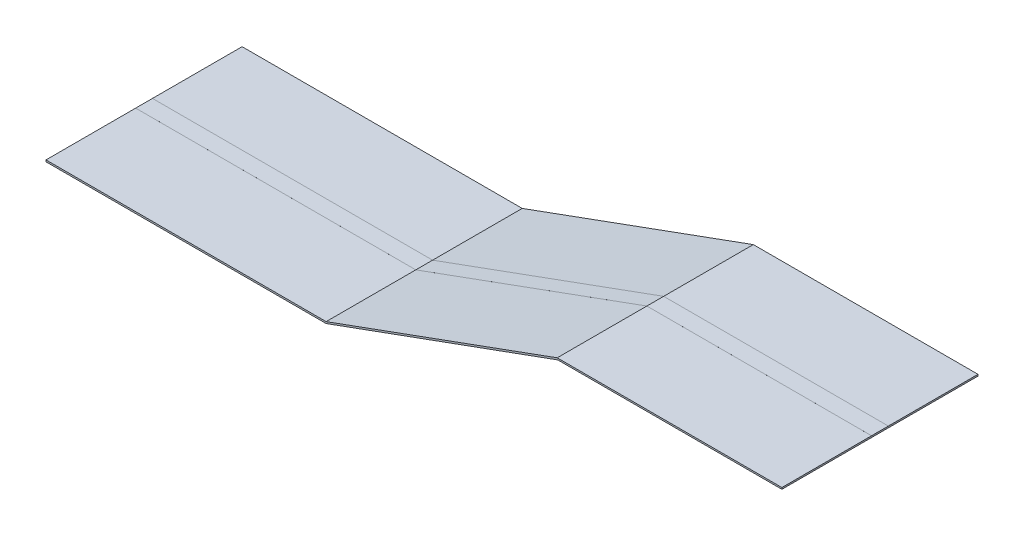
ISO-10303-21;
HEADER;
FILE_DESCRIPTION(('STEP AP214'),'2;1');
FILE_NAME('part.step','',(''),(''),'','','');
FILE_SCHEMA(('AUTOMOTIVE_DESIGN { 1 0 10303 214 1 1 1 1 }'));
ENDSEC;
DATA;
#1=APPLICATION_CONTEXT('core data for automotive mechanical design processes');
#2=APPLICATION_PROTOCOL_DEFINITION('international standard','automotive_design',2000,#1);
#3=PRODUCT_CONTEXT('',#1,'mechanical');
#4=PRODUCT('Part','Part','',(#3));
#5=PRODUCT_RELATED_PRODUCT_CATEGORY('part','',(#4));
#6=PRODUCT_DEFINITION_FORMATION('','',#4);
#7=PRODUCT_DEFINITION_CONTEXT('part definition',#1,'design');
#8=PRODUCT_DEFINITION('design','',#6,#7);
#9=PRODUCT_DEFINITION_SHAPE('','',#8);
#10=(LENGTH_UNIT() NAMED_UNIT(*) SI_UNIT(.MILLI.,.METRE.));
#11=(NAMED_UNIT(*) PLANE_ANGLE_UNIT() SI_UNIT($,.RADIAN.));
#12=(NAMED_UNIT(*) SI_UNIT($,.STERADIAN.) SOLID_ANGLE_UNIT());
#13=UNCERTAINTY_MEASURE_WITH_UNIT(LENGTH_MEASURE(1.E-05),#10,'distance_accuracy_value','');
#14=(GEOMETRIC_REPRESENTATION_CONTEXT(3) GLOBAL_UNCERTAINTY_ASSIGNED_CONTEXT((#13)) GLOBAL_UNIT_ASSIGNED_CONTEXT((#10,
#11,#12)) REPRESENTATION_CONTEXT('',''));
#15=CARTESIAN_POINT('',(0.,0.,0.));
#16=DIRECTION('',(0.,0.,1.));
#17=DIRECTION('',(1.,0.,0.));
#18=AXIS2_PLACEMENT_3D('',#15,#16,#17);
#19=CARTESIAN_POINT('',(412.43753092473,153.307517797124,350.));
#20=DIRECTION('',(0.,-1.,0.));
#21=DIRECTION('',(0.,0.,-1.));
#22=AXIS2_PLACEMENT_3D('',#19,#20,#21);
#23=PLANE('',#22);
#24=DIRECTION('',(1.,0.,0.));
#25=VECTOR('',#24,1.);
#26=CARTESIAN_POINT('',(813.46132907173,153.307517797124,190.));
#27=LINE('',#26,#25);
#28=CARTESIAN_POINT('',(412.43753092473,153.307517797124,190.));
#29=VERTEX_POINT('',#28);
#30=CARTESIAN_POINT('',(813.46132907173,153.307517797124,190.));
#31=VERTEX_POINT('',#30);
#32=EDGE_CURVE('E322',#29,#31,#27,.T.);
#33=ORIENTED_EDGE('',*,*,#32,.F.);
#34=DIRECTION('',(0.,0.,-1.));
#35=VECTOR('',#34,1.);
#36=CARTESIAN_POINT('',(412.43753092473,153.307517797124,350.));
#37=LINE('',#36,#35);
#38=CARTESIAN_POINT('',(412.43753092473,153.307517797124,350.));
#39=VERTEX_POINT('',#38);
#40=EDGE_CURVE('E264',#39,#29,#37,.T.);
#41=ORIENTED_EDGE('',*,*,#40,.F.);
#42=DIRECTION('',(-1.,0.,0.));
#43=VECTOR('',#42,1.);
#44=CARTESIAN_POINT('',(412.43753092473,153.307517797124,350.));
#45=LINE('',#44,#43);
#46=CARTESIAN_POINT('',(813.4647531458,153.307517797124,350.));
#47=VERTEX_POINT('',#46);
#48=EDGE_CURVE('E221',#47,#39,#45,.T.);
#49=ORIENTED_EDGE('',*,*,#48,.F.);
#50=DIRECTION('',(0.,0.,-1.));
#51=VECTOR('',#50,1.);
#52=CARTESIAN_POINT('',(813.4647531458,153.307517797124,350.));
#53=LINE('',#52,#51);
#54=CARTESIAN_POINT('',(813.4647531458,153.307517797124,0.));
#55=VERTEX_POINT('',#54);
#56=EDGE_CURVE('E267',#47,#55,#53,.T.);
#57=ORIENTED_EDGE('',*,*,#56,.T.);
#58=DIRECTION('',(-1.,0.,0.));
#59=VECTOR('',#58,1.);
#60=CARTESIAN_POINT('',(412.43753092473,153.307517797124,0.));
#61=LINE('',#60,#59);
#62=CARTESIAN_POINT('',(412.43753092473,153.307517797124,0.));
#63=VERTEX_POINT('',#62);
#64=EDGE_CURVE('E238',#55,#63,#61,.T.);
#65=ORIENTED_EDGE('',*,*,#64,.T.);
#66=CARTESIAN_POINT('',(412.43753092473,153.307517797124,160.));
#67=VERTEX_POINT('',#66);
#68=EDGE_CURVE('E263',#67,#63,#37,.T.);
#69=ORIENTED_EDGE('',*,*,#68,.F.);
#70=DIRECTION('',(-1.,0.,0.));
#71=VECTOR('',#70,1.);
#72=CARTESIAN_POINT('',(813.46132907173,153.307517797124,160.));
#73=LINE('',#72,#71);
#74=CARTESIAN_POINT('',(813.46132907173,153.307517797124,160.));
#75=VERTEX_POINT('',#74);
#76=EDGE_CURVE('E169',#75,#67,#73,.T.);
#77=ORIENTED_EDGE('',*,*,#76,.F.);
#78=DIRECTION('',(0.,0.,-1.));
#79=VECTOR('',#78,1.);
#80=CARTESIAN_POINT('',(813.46132907173,153.307517797124,190.));
#81=LINE('',#80,#79);
#82=EDGE_CURVE('E318',#31,#75,#81,.T.);
#83=ORIENTED_EDGE('',*,*,#82,.F.);
#84=EDGE_LOOP('',(#33,#41,#49,#57,#65,#69,#77,#83));
#85=FACE_BOUND('',#84,.T.);
#86=ADVANCED_FACE('F32',(#85),#23,.F.);
#87=CARTESIAN_POINT('',(0.,2.99999999999994,350.));
#88=DIRECTION('',(0.342407407023272,-0.939551577943223,0.));
#89=DIRECTION('',(0.939551577943223,0.342407407023272,0.));
#90=AXIS2_PLACEMENT_3D('',#87,#88,#89);
#91=PLANE('',#90);
#92=DIRECTION('',(0.939551577943223,0.342407407023272,0.));
#93=VECTOR('',#92,1.);
#94=CARTESIAN_POINT('',(412.43753092473,153.307517797124,190.));
#95=LINE('',#94,#93);
#96=CARTESIAN_POINT('',(0.,2.99999999999994,190.));
#97=VERTEX_POINT('',#96);
#98=EDGE_CURVE('E175',#97,#29,#95,.T.);
#99=ORIENTED_EDGE('',*,*,#98,.F.);
#100=DIRECTION('',(0.,0.,-1.));
#101=VECTOR('',#100,1.);
#102=CARTESIAN_POINT('',(0.,2.99999999999994,350.));
#103=LINE('',#102,#101);
#104=CARTESIAN_POINT('',(0.,2.99999999999994,350.));
#105=VERTEX_POINT('',#104);
#106=EDGE_CURVE('E260',#105,#97,#103,.T.);
#107=ORIENTED_EDGE('',*,*,#106,.F.);
#108=DIRECTION('',(-0.939551577943223,-0.342407407023272,0.));
#109=VECTOR('',#108,1.);
#110=CARTESIAN_POINT('',(0.,2.99999999999994,350.));
#111=LINE('',#110,#109);
#112=EDGE_CURVE('E223',#39,#105,#111,.T.);
#113=ORIENTED_EDGE('',*,*,#112,.F.);
#114=ORIENTED_EDGE('',*,*,#40,.T.);
#115=EDGE_LOOP('',(#99,#107,#113,#114));
#116=FACE_BOUND('',#115,.T.);
#117=ADVANCED_FACE('F343',(#116),#91,.F.);
#118=DIRECTION('',(-0.939551577943223,-0.342407407023272,0.));
#119=VECTOR('',#118,1.);
#120=CARTESIAN_POINT('',(412.43753092473,153.307517797124,160.));
#121=LINE('',#120,#119);
#122=CARTESIAN_POINT('',(0.,2.99999999999994,160.));
#123=VERTEX_POINT('',#122);
#124=EDGE_CURVE('E186',#67,#123,#121,.T.);
#125=ORIENTED_EDGE('',*,*,#124,.F.);
#126=ORIENTED_EDGE('',*,*,#68,.T.);
#127=DIRECTION('',(-0.939551577943223,-0.342407407023272,0.));
#128=VECTOR('',#127,1.);
#129=CARTESIAN_POINT('',(0.,2.99999999999994,0.));
#130=LINE('',#129,#128);
#131=CARTESIAN_POINT('',(0.,2.99999999999994,0.));
#132=VERTEX_POINT('',#131);
#133=EDGE_CURVE('E241',#63,#132,#130,.T.);
#134=ORIENTED_EDGE('',*,*,#133,.T.);
#135=EDGE_CURVE('E259',#123,#132,#103,.T.);
#136=ORIENTED_EDGE('',*,*,#135,.F.);
#137=EDGE_LOOP('',(#125,#126,#134,#136));
#138=FACE_BOUND('',#137,.T.);
#139=ADVANCED_FACE('F314',(#138),#91,.F.);
#140=CARTESIAN_POINT('',(-500.,2.99999999999994,350.));
#141=DIRECTION('',(0.,-1.,0.));
#142=DIRECTION('',(0.,0.,-1.));
#143=AXIS2_PLACEMENT_3D('',#140,#141,#142);
#144=PLANE('',#143);
#145=DIRECTION('',(-1.,0.,0.));
#146=VECTOR('',#145,1.);
#147=CARTESIAN_POINT('',(-500.,2.99999999999994,160.));
#148=LINE('',#147,#146);
#149=CARTESIAN_POINT('',(-500.,2.99999999999994,160.));
#150=VERTEX_POINT('',#149);
#151=EDGE_CURVE('E197',#123,#150,#148,.T.);
#152=ORIENTED_EDGE('',*,*,#151,.F.);
#153=ORIENTED_EDGE('',*,*,#135,.T.);
#154=DIRECTION('',(-1.,0.,0.));
#155=VECTOR('',#154,1.);
#156=CARTESIAN_POINT('',(-500.,2.99999999999994,0.));
#157=LINE('',#156,#155);
#158=CARTESIAN_POINT('',(-500.,2.99999999999994,0.));
#159=VERTEX_POINT('',#158);
#160=EDGE_CURVE('E244',#132,#159,#157,.T.);
#161=ORIENTED_EDGE('',*,*,#160,.T.);
#162=DIRECTION('',(0.,0.,-1.));
#163=VECTOR('',#162,1.);
#164=CARTESIAN_POINT('',(-500.,2.99999999999994,350.));
#165=LINE('',#164,#163);
#166=EDGE_CURVE('E255',#150,#159,#165,.T.);
#167=ORIENTED_EDGE('',*,*,#166,.F.);
#168=EDGE_LOOP('',(#152,#153,#161,#167));
#169=FACE_BOUND('',#168,.T.);
#170=ADVANCED_FACE('F310',(#169),#144,.F.);
#171=DIRECTION('',(1.,0.,0.));
#172=VECTOR('',#171,1.);
#173=CARTESIAN_POINT('',(-500.,2.99999999999994,190.));
#174=LINE('',#173,#172);
#175=CARTESIAN_POINT('',(-500.,2.99999999999994,190.));
#176=VERTEX_POINT('',#175);
#177=EDGE_CURVE('E201',#176,#97,#174,.T.);
#178=ORIENTED_EDGE('',*,*,#177,.F.);
#179=CARTESIAN_POINT('',(-500.,2.99999999999994,350.));
#180=VERTEX_POINT('',#179);
#181=EDGE_CURVE('E256',#180,#176,#165,.T.);
#182=ORIENTED_EDGE('',*,*,#181,.F.);
#183=DIRECTION('',(-1.,0.,0.));
#184=VECTOR('',#183,1.);
#185=CARTESIAN_POINT('',(-500.,2.99999999999994,350.));
#186=LINE('',#185,#184);
#187=EDGE_CURVE('E225',#105,#180,#186,.T.);
#188=ORIENTED_EDGE('',*,*,#187,.F.);
#189=ORIENTED_EDGE('',*,*,#106,.T.);
#190=EDGE_LOOP('',(#178,#182,#188,#189));
#191=FACE_BOUND('',#190,.T.);
#192=ADVANCED_FACE('F347',(#191),#144,.F.);
#193=CARTESIAN_POINT('',(413.4647531458,150.488863063295,350.));
#194=DIRECTION('',(-0.34202014332567,0.939692620785908,0.));
#195=DIRECTION('',(-0.939692620785908,-0.34202014332567,0.));
#196=AXIS2_PLACEMENT_3D('',#193,#194,#195);
#197=PLANE('',#196);
#198=DIRECTION('',(0.939692620785908,0.34202014332567,0.));
#199=VECTOR('',#198,1.);
#200=CARTESIAN_POINT('',(413.4647531458,150.488863063295,0.));
#201=LINE('',#200,#199);
#202=CARTESIAN_POINT('',(0.,0.,0.));
#203=VERTEX_POINT('',#202);
#204=CARTESIAN_POINT('',(413.4647531458,150.488863063295,0.));
#205=VERTEX_POINT('',#204);
#206=EDGE_CURVE('E212',#203,#205,#201,.T.);
#207=ORIENTED_EDGE('',*,*,#206,.T.);
#208=DIRECTION('',(0.,0.,-1.));
#209=VECTOR('',#208,1.);
#210=CARTESIAN_POINT('',(413.4647531458,150.488863063295,350.));
#211=LINE('',#210,#209);
#212=CARTESIAN_POINT('',(413.4647531458,150.488863063295,350.));
#213=VERTEX_POINT('',#212);
#214=EDGE_CURVE('E40',#213,#205,#211,.T.);
#215=ORIENTED_EDGE('',*,*,#214,.F.);
#216=DIRECTION('',(0.939692620785908,0.34202014332567,0.));
#217=VECTOR('',#216,1.);
#218=CARTESIAN_POINT('',(413.4647531458,150.488863063295,350.));
#219=LINE('',#218,#217);
#220=CARTESIAN_POINT('',(0.,0.,350.));
#221=VERTEX_POINT('',#220);
#222=EDGE_CURVE('E213',#221,#213,#219,.T.);
#223=ORIENTED_EDGE('',*,*,#222,.F.);
#224=DIRECTION('',(0.,0.,-1.));
#225=VECTOR('',#224,1.);
#226=CARTESIAN_POINT('',(0.,0.,350.));
#227=LINE('',#226,#225);
#228=EDGE_CURVE('E231',#221,#203,#227,.T.);
#229=ORIENTED_EDGE('',*,*,#228,.T.);
#230=EDGE_LOOP('',(#207,#215,#223,#229));
#231=FACE_BOUND('',#230,.T.);
#232=ADVANCED_FACE('F34',(#231),#197,.F.);
#233=CARTESIAN_POINT('',(413.4647531458,150.488863063295,350.));
#234=DIRECTION('',(0.,1.,0.));
#235=DIRECTION('',(0.,0.,1.));
#236=AXIS2_PLACEMENT_3D('',#233,#234,#235);
#237=PLANE('',#236);
#238=DIRECTION('',(1.,0.,0.));
#239=VECTOR('',#238,1.);
#240=CARTESIAN_POINT('',(413.4647531458,150.488863063295,0.));
#241=LINE('',#240,#239);
#242=CARTESIAN_POINT('',(813.4647531458,150.488863063295,0.));
#243=VERTEX_POINT('',#242);
#244=EDGE_CURVE('E234',#205,#243,#241,.T.);
#245=ORIENTED_EDGE('',*,*,#244,.T.);
#246=DIRECTION('',(0.,0.,-1.));
#247=VECTOR('',#246,1.);
#248=CARTESIAN_POINT('',(813.4647531458,150.488863063295,350.));
#249=LINE('',#248,#247);
#250=CARTESIAN_POINT('',(813.4647531458,150.488863063295,350.));
#251=VERTEX_POINT('',#250);
#252=EDGE_CURVE('E270',#251,#243,#249,.T.);
#253=ORIENTED_EDGE('',*,*,#252,.F.);
#254=DIRECTION('',(1.,0.,0.));
#255=VECTOR('',#254,1.);
#256=CARTESIAN_POINT('',(413.4647531458,150.488863063295,350.));
#257=LINE('',#256,#255);
#258=EDGE_CURVE('E216',#213,#251,#257,.T.);
#259=ORIENTED_EDGE('',*,*,#258,.F.);
#260=ORIENTED_EDGE('',*,*,#214,.T.);
#261=EDGE_LOOP('',(#245,#253,#259,#260));
#262=FACE_BOUND('',#261,.T.);
#263=ADVANCED_FACE('F275',(#262),#237,.F.);
#264=CARTESIAN_POINT('',(813.4647531458,153.307517797124,350.));
#265=DIRECTION('',(-1.,0.,0.));
#266=DIRECTION('',(0.,-1.,0.));
#267=AXIS2_PLACEMENT_3D('',#264,#265,#266);
#268=PLANE('',#267);
#269=DIRECTION('',(0.,1.,0.));
#270=VECTOR('',#269,1.);
#271=CARTESIAN_POINT('',(813.4647531458,153.307517797124,0.));
#272=LINE('',#271,#270);
#273=EDGE_CURVE('E236',#243,#55,#272,.T.);
#274=ORIENTED_EDGE('',*,*,#273,.T.);
#275=ORIENTED_EDGE('',*,*,#56,.F.);
#276=DIRECTION('',(0.,1.,0.));
#277=VECTOR('',#276,1.);
#278=CARTESIAN_POINT('',(813.4647531458,153.307517797124,350.));
#279=LINE('',#278,#277);
#280=EDGE_CURVE('E219',#251,#47,#279,.T.);
#281=ORIENTED_EDGE('',*,*,#280,.F.);
#282=ORIENTED_EDGE('',*,*,#252,.T.);
#283=EDGE_LOOP('',(#274,#275,#281,#282));
#284=FACE_BOUND('',#283,.T.);
#285=ADVANCED_FACE('F290',(#284),#268,.F.);
#286=CARTESIAN_POINT('',(-500.,0.,350.));
#287=DIRECTION('',(1.,0.,0.));
#288=DIRECTION('',(0.,0.,-1.));
#289=AXIS2_PLACEMENT_3D('',#286,#287,#288);
#290=PLANE('',#289);
#291=DIRECTION('',(0.,-1.,0.));
#292=VECTOR('',#291,1.);
#293=CARTESIAN_POINT('',(-500.,0.,0.));
#294=LINE('',#293,#292);
#295=CARTESIAN_POINT('',(-500.,0.,0.));
#296=VERTEX_POINT('',#295);
#297=EDGE_CURVE('E247',#159,#296,#294,.T.);
#298=ORIENTED_EDGE('',*,*,#297,.T.);
#299=DIRECTION('',(0.,0.,-1.));
#300=VECTOR('',#299,1.);
#301=CARTESIAN_POINT('',(-500.,0.,350.));
#302=LINE('',#301,#300);
#303=CARTESIAN_POINT('',(-500.,0.,350.));
#304=VERTEX_POINT('',#303);
#305=EDGE_CURVE('E252',#304,#296,#302,.T.);
#306=ORIENTED_EDGE('',*,*,#305,.F.);
#307=DIRECTION('',(0.,-1.,0.));
#308=VECTOR('',#307,1.);
#309=CARTESIAN_POINT('',(-500.,0.,350.));
#310=LINE('',#309,#308);
#311=EDGE_CURVE('E227',#180,#304,#310,.T.);
#312=ORIENTED_EDGE('',*,*,#311,.F.);
#313=ORIENTED_EDGE('',*,*,#181,.T.);
#314=DIRECTION('',(0.,-1.,0.));
#315=VECTOR('',#314,1.);
#316=CARTESIAN_POINT('',(-500.,3.00999999999994,190.));
#317=LINE('',#316,#315);
#318=CARTESIAN_POINT('',(-500.,3.00999999999994,190.));
#319=VERTEX_POINT('',#318);
#320=EDGE_CURVE('E206',#319,#176,#317,.T.);
#321=ORIENTED_EDGE('',*,*,#320,.F.);
#322=DIRECTION('',(0.,0.,1.));
#323=VECTOR('',#322,1.);
#324=CARTESIAN_POINT('',(-500.,3.00999999999994,190.));
#325=LINE('',#324,#323);
#326=CARTESIAN_POINT('',(-500.,3.00999999999994,160.));
#327=VERTEX_POINT('',#326);
#328=EDGE_CURVE('E200',#327,#319,#325,.T.);
#329=ORIENTED_EDGE('',*,*,#328,.F.);
#330=DIRECTION('',(0.,-1.,0.));
#331=VECTOR('',#330,1.);
#332=CARTESIAN_POINT('',(-500.,3.00999999999994,160.));
#333=LINE('',#332,#331);
#334=EDGE_CURVE('E54',#327,#150,#333,.T.);
#335=ORIENTED_EDGE('',*,*,#334,.T.);
#336=ORIENTED_EDGE('',*,*,#166,.T.);
#337=EDGE_LOOP('',(#298,#306,#312,#313,#321,#329,#335,#336));
#338=FACE_BOUND('',#337,.T.);
#339=ADVANCED_FACE('F305',(#338),#290,.F.);
#340=CARTESIAN_POINT('',(0.,0.,350.));
#341=DIRECTION('',(0.,1.,0.));
#342=DIRECTION('',(-1.,0.,0.));
#343=AXIS2_PLACEMENT_3D('',#340,#341,#342);
#344=PLANE('',#343);
#345=DIRECTION('',(1.,0.,0.));
#346=VECTOR('',#345,1.);
#347=CARTESIAN_POINT('',(0.,0.,0.));
#348=LINE('',#347,#346);
#349=EDGE_CURVE('E217',#296,#203,#348,.T.);
#350=ORIENTED_EDGE('',*,*,#349,.T.);
#351=ORIENTED_EDGE('',*,*,#228,.F.);
#352=DIRECTION('',(1.,0.,0.));
#353=VECTOR('',#352,1.);
#354=CARTESIAN_POINT('',(0.,0.,350.));
#355=LINE('',#354,#353);
#356=EDGE_CURVE('E229',#304,#221,#355,.T.);
#357=ORIENTED_EDGE('',*,*,#356,.F.);
#358=ORIENTED_EDGE('',*,*,#305,.T.);
#359=EDGE_LOOP('',(#350,#351,#357,#358));
#360=FACE_BOUND('',#359,.T.);
#361=ADVANCED_FACE('F304',(#360),#344,.F.);
#362=CARTESIAN_POINT('',(0.,0.,350.));
#363=DIRECTION('',(0.,0.,-1.));
#364=DIRECTION('',(-1.,0.,0.));
#365=AXIS2_PLACEMENT_3D('',#362,#363,#364);
#366=PLANE('',#365);
#367=ORIENTED_EDGE('',*,*,#222,.T.);
#368=ORIENTED_EDGE('',*,*,#258,.T.);
#369=ORIENTED_EDGE('',*,*,#280,.T.);
#370=ORIENTED_EDGE('',*,*,#48,.T.);
#371=ORIENTED_EDGE('',*,*,#112,.T.);
#372=ORIENTED_EDGE('',*,*,#187,.T.);
#373=ORIENTED_EDGE('',*,*,#311,.T.);
#374=ORIENTED_EDGE('',*,*,#356,.T.);
#375=EDGE_LOOP('',(#367,#368,#369,#370,#371,#372,#373,#374));
#376=FACE_BOUND('',#375,.T.);
#377=ADVANCED_FACE('F298',(#376),#366,.F.);
#378=CARTESIAN_POINT('',(0.,0.,0.));
#379=DIRECTION('',(0.,0.,-1.));
#380=DIRECTION('',(-1.,0.,0.));
#381=AXIS2_PLACEMENT_3D('',#378,#379,#380);
#382=PLANE('',#381);
#383=ORIENTED_EDGE('',*,*,#206,.F.);
#384=ORIENTED_EDGE('',*,*,#349,.F.);
#385=ORIENTED_EDGE('',*,*,#297,.F.);
#386=ORIENTED_EDGE('',*,*,#160,.F.);
#387=ORIENTED_EDGE('',*,*,#133,.F.);
#388=ORIENTED_EDGE('',*,*,#64,.F.);
#389=ORIENTED_EDGE('',*,*,#273,.F.);
#390=ORIENTED_EDGE('',*,*,#244,.F.);
#391=EDGE_LOOP('',(#383,#384,#385,#386,#387,#388,#389,#390));
#392=FACE_BOUND('',#391,.T.);
#393=ADVANCED_FACE('F283',(#392),#382,.T.);
#394=CARTESIAN_POINT('',(-500.,3.00999999999994,160.));
#395=DIRECTION('',(0.,0.,1.));
#396=DIRECTION('',(1.,0.,0.));
#397=AXIS2_PLACEMENT_3D('',#394,#395,#396);
#398=PLANE('',#397);
#399=ORIENTED_EDGE('',*,*,#124,.T.);
#400=ORIENTED_EDGE('',*,*,#151,.T.);
#401=ORIENTED_EDGE('',*,*,#334,.F.);
#402=DIRECTION('',(-1.,0.,0.));
#403=VECTOR('',#402,1.);
#404=CARTESIAN_POINT('',(-500.,3.00999999999994,160.));
#405=LINE('',#404,#403);
#406=CARTESIAN_POINT('',(-0.00176539469703973,3.00999999999994,160.));
#407=VERTEX_POINT('',#406);
#408=EDGE_CURVE('E198',#407,#327,#405,.T.);
#409=ORIENTED_EDGE('',*,*,#408,.F.);
#410=DIRECTION('',(-0.939551577943223,-0.342407407023272,0.));
#411=VECTOR('',#410,1.);
#412=CARTESIAN_POINT('',(412.43410685066,153.316913312904,160.));
#413=LINE('',#412,#411);
#414=CARTESIAN_POINT('',(412.43410685066,153.316913312904,160.));
#415=VERTEX_POINT('',#414);
#416=EDGE_CURVE('E47',#415,#407,#413,.T.);
#417=ORIENTED_EDGE('',*,*,#416,.F.);
#418=DIRECTION('',(0.342407407023272,-0.939551577943223,0.));
#419=VECTOR('',#418,1.);
#420=CARTESIAN_POINT('',(412.43410685066,153.316913312904,160.));
#421=LINE('',#420,#419);
#422=EDGE_CURVE('E188',#415,#67,#421,.T.);
#423=ORIENTED_EDGE('',*,*,#422,.T.);
#424=EDGE_LOOP('',(#399,#400,#401,#409,#417,#423));
#425=FACE_BOUND('',#424,.T.);
#426=ADVANCED_FACE('F354',(#425),#398,.F.);
#427=CARTESIAN_POINT('',(-500.,3.00999999999994,190.));
#428=DIRECTION('',(0.,0.,-1.));
#429=DIRECTION('',(-1.,0.,0.));
#430=AXIS2_PLACEMENT_3D('',#427,#428,#429);
#431=PLANE('',#430);
#432=ORIENTED_EDGE('',*,*,#177,.T.);
#433=ORIENTED_EDGE('',*,*,#98,.T.);
#434=DIRECTION('',(0.342407407023272,-0.939551577943223,0.));
#435=VECTOR('',#434,1.);
#436=CARTESIAN_POINT('',(412.43410685066,153.316913312904,190.));
#437=LINE('',#436,#435);
#438=CARTESIAN_POINT('',(412.43410685066,153.316913312904,190.));
#439=VERTEX_POINT('',#438);
#440=EDGE_CURVE('E194',#439,#29,#437,.T.);
#441=ORIENTED_EDGE('',*,*,#440,.F.);
#442=DIRECTION('',(0.939551577943223,0.342407407023272,0.));
#443=VECTOR('',#442,1.);
#444=CARTESIAN_POINT('',(412.43410685066,153.316913312904,190.));
#445=LINE('',#444,#443);
#446=CARTESIAN_POINT('',(-0.00176539469715076,3.0099999999999,190.));
#447=VERTEX_POINT('',#446);
#448=EDGE_CURVE('E183',#447,#439,#445,.T.);
#449=ORIENTED_EDGE('',*,*,#448,.F.);
#450=DIRECTION('',(1.,0.,0.));
#451=VECTOR('',#450,1.);
#452=CARTESIAN_POINT('',(-500.,3.00999999999994,190.));
#453=LINE('',#452,#451);
#454=EDGE_CURVE('E203',#319,#447,#453,.T.);
#455=ORIENTED_EDGE('',*,*,#454,.F.);
#456=ORIENTED_EDGE('',*,*,#320,.T.);
#457=EDGE_LOOP('',(#432,#433,#441,#449,#455,#456));
#458=FACE_BOUND('',#457,.T.);
#459=ADVANCED_FACE('F335',(#458),#431,.F.);
#460=CARTESIAN_POINT('',(0.,3.00999999999994,0.));
#461=DIRECTION('',(0.,-1.,0.));
#462=DIRECTION('',(0.,0.,-1.));
#463=AXIS2_PLACEMENT_3D('',#460,#461,#462);
#464=PLANE('',#463);
#465=ORIENTED_EDGE('',*,*,#454,.T.);
#466=DIRECTION('',(0.,0.,-1.));
#467=VECTOR('',#466,1.);
#468=CARTESIAN_POINT('',(-0.00176539469706682,3.00999999999994,0.));
#469=LINE('',#468,#467);
#470=EDGE_CURVE('E11',#447,#407,#469,.T.);
#471=ORIENTED_EDGE('',*,*,#470,.T.);
#472=ORIENTED_EDGE('',*,*,#408,.T.);
#473=ORIENTED_EDGE('',*,*,#328,.T.);
#474=EDGE_LOOP('',(#465,#471,#472,#473));
#475=FACE_BOUND('',#474,.T.);
#476=ADVANCED_FACE('F351',(#475),#464,.F.);
#477=CARTESIAN_POINT('',(-0.96855233277471,2.6576670186262,0.));
#478=DIRECTION('',(-0.342407407023272,0.939551577943223,0.));
#479=DIRECTION('',(-0.939551577943223,-0.342407407023272,0.));
#480=AXIS2_PLACEMENT_3D('',#477,#478,#479);
#481=PLANE('',#480);
#482=ORIENTED_EDGE('',*,*,#470,.F.);
#483=ORIENTED_EDGE('',*,*,#448,.T.);
#484=DIRECTION('',(0.,0.,-1.));
#485=VECTOR('',#484,1.);
#486=CARTESIAN_POINT('',(412.43410685066,153.316913312904,190.));
#487=LINE('',#486,#485);
#488=EDGE_CURVE('E185',#439,#415,#487,.T.);
#489=ORIENTED_EDGE('',*,*,#488,.T.);
#490=ORIENTED_EDGE('',*,*,#416,.T.);
#491=EDGE_LOOP('',(#482,#483,#489,#490));
#492=FACE_BOUND('',#491,.T.);
#493=ADVANCED_FACE('F424',(#492),#481,.T.);
#494=CARTESIAN_POINT('',(412.43410685066,153.316913312904,190.));
#495=DIRECTION('',(-0.939551577943223,-0.342407407023272,0.));
#496=DIRECTION('',(0.342407407023272,-0.939551577943223,0.));
#497=AXIS2_PLACEMENT_3D('',#494,#495,#496);
#498=PLANE('',#497);
#499=DIRECTION('',(0.,0.,-1.));
#500=VECTOR('',#499,1.);
#501=CARTESIAN_POINT('',(412.43753092473,153.307517797124,190.));
#502=LINE('',#501,#500);
#503=EDGE_CURVE('E173',#29,#67,#502,.T.);
#504=ORIENTED_EDGE('',*,*,#503,.T.);
#505=ORIENTED_EDGE('',*,*,#422,.F.);
#506=ORIENTED_EDGE('',*,*,#488,.F.);
#507=ORIENTED_EDGE('',*,*,#440,.T.);
#508=EDGE_LOOP('',(#504,#505,#506,#507));
#509=FACE_BOUND('',#508,.T.);
#510=ADVANCED_FACE('F341',(#509),#498,.F.);
#511=CARTESIAN_POINT('',(412.43753092473,153.317517797124,190.));
#512=DIRECTION('',(1.,0.,0.));
#513=DIRECTION('',(0.,0.,-1.));
#514=AXIS2_PLACEMENT_3D('',#511,#512,#513);
#515=PLANE('',#514);
#516=ORIENTED_EDGE('',*,*,#503,.F.);
#517=DIRECTION('',(0.,-1.,0.));
#518=VECTOR('',#517,1.);
#519=CARTESIAN_POINT('',(412.43753092473,153.317517797124,190.));
#520=LINE('',#519,#518);
#521=CARTESIAN_POINT('',(412.43753092473,153.317517797124,190.));
#522=VERTEX_POINT('',#521);
#523=EDGE_CURVE('E154',#522,#29,#520,.T.);
#524=ORIENTED_EDGE('',*,*,#523,.F.);
#525=DIRECTION('',(0.,0.,1.));
#526=VECTOR('',#525,1.);
#527=CARTESIAN_POINT('',(412.43753092473,153.317517797124,190.));
#528=LINE('',#527,#526);
#529=CARTESIAN_POINT('',(412.43753092473,153.317517797124,160.));
#530=VERTEX_POINT('',#529);
#531=EDGE_CURVE('E161',#530,#522,#528,.T.);
#532=ORIENTED_EDGE('',*,*,#531,.F.);
#533=DIRECTION('',(0.,-1.,0.));
#534=VECTOR('',#533,1.);
#535=CARTESIAN_POINT('',(412.43753092473,153.317517797124,160.));
#536=LINE('',#535,#534);
#537=EDGE_CURVE('E326',#530,#67,#536,.T.);
#538=ORIENTED_EDGE('',*,*,#537,.T.);
#539=EDGE_LOOP('',(#516,#524,#532,#538));
#540=FACE_BOUND('',#539,.T.);
#541=ADVANCED_FACE('F171',(#540),#515,.F.);
#542=CARTESIAN_POINT('',(813.46132907173,153.317517797124,190.));
#543=DIRECTION('',(0.,0.,-1.));
#544=DIRECTION('',(-1.,0.,0.));
#545=AXIS2_PLACEMENT_3D('',#542,#543,#544);
#546=PLANE('',#545);
#547=ORIENTED_EDGE('',*,*,#32,.T.);
#548=DIRECTION('',(0.,-1.,0.));
#549=VECTOR('',#548,1.);
#550=CARTESIAN_POINT('',(813.46132907173,153.317517797124,190.));
#551=LINE('',#550,#549);
#552=CARTESIAN_POINT('',(813.46132907173,153.317517797124,190.));
#553=VERTEX_POINT('',#552);
#554=EDGE_CURVE('E157',#553,#31,#551,.T.);
#555=ORIENTED_EDGE('',*,*,#554,.F.);
#556=DIRECTION('',(1.,0.,0.));
#557=VECTOR('',#556,1.);
#558=CARTESIAN_POINT('',(813.46132907173,153.317517797124,190.));
#559=LINE('',#558,#557);
#560=EDGE_CURVE('E150',#522,#553,#559,.T.);
#561=ORIENTED_EDGE('',*,*,#560,.F.);
#562=ORIENTED_EDGE('',*,*,#523,.T.);
#563=EDGE_LOOP('',(#547,#555,#561,#562));
#564=FACE_BOUND('',#563,.T.);
#565=ADVANCED_FACE('F152',(#564),#546,.F.);
#566=CARTESIAN_POINT('',(813.46132907173,153.317517797124,190.));
#567=DIRECTION('',(-1.,0.,0.));
#568=DIRECTION('',(0.,0.,1.));
#569=AXIS2_PLACEMENT_3D('',#566,#567,#568);
#570=PLANE('',#569);
#571=ORIENTED_EDGE('',*,*,#82,.T.);
#572=DIRECTION('',(0.,-1.,0.));
#573=VECTOR('',#572,1.);
#574=CARTESIAN_POINT('',(813.46132907173,153.317517797124,160.));
#575=LINE('',#574,#573);
#576=CARTESIAN_POINT('',(813.46132907173,153.317517797124,160.));
#577=VERTEX_POINT('',#576);
#578=EDGE_CURVE('E179',#577,#75,#575,.T.);
#579=ORIENTED_EDGE('',*,*,#578,.F.);
#580=DIRECTION('',(0.,0.,-1.));
#581=VECTOR('',#580,1.);
#582=CARTESIAN_POINT('',(813.46132907173,153.317517797124,190.));
#583=LINE('',#582,#581);
#584=EDGE_CURVE('E160',#553,#577,#583,.T.);
#585=ORIENTED_EDGE('',*,*,#584,.F.);
#586=ORIENTED_EDGE('',*,*,#554,.T.);
#587=EDGE_LOOP('',(#571,#579,#585,#586));
#588=FACE_BOUND('',#587,.T.);
#589=ADVANCED_FACE('F330',(#588),#570,.F.);
#590=CARTESIAN_POINT('',(813.46132907173,153.317517797124,160.));
#591=DIRECTION('',(0.,0.,1.));
#592=DIRECTION('',(1.,0.,0.));
#593=AXIS2_PLACEMENT_3D('',#590,#591,#592);
#594=PLANE('',#593);
#595=ORIENTED_EDGE('',*,*,#76,.T.);
#596=ORIENTED_EDGE('',*,*,#537,.F.);
#597=DIRECTION('',(-1.,0.,0.));
#598=VECTOR('',#597,1.);
#599=CARTESIAN_POINT('',(813.46132907173,153.317517797124,160.));
#600=LINE('',#599,#598);
#601=EDGE_CURVE('E166',#577,#530,#600,.T.);
#602=ORIENTED_EDGE('',*,*,#601,.F.);
#603=ORIENTED_EDGE('',*,*,#578,.T.);
#604=EDGE_LOOP('',(#595,#596,#602,#603));
#605=FACE_BOUND('',#604,.T.);
#606=ADVANCED_FACE('F328',(#605),#594,.F.);
#607=CARTESIAN_POINT('',(0.,153.317517797124,0.));
#608=DIRECTION('',(0.,1.,0.));
#609=DIRECTION('',(0.,0.,1.));
#610=AXIS2_PLACEMENT_3D('',#607,#608,#609);
#611=PLANE('',#610);
#612=ORIENTED_EDGE('',*,*,#531,.T.);
#613=ORIENTED_EDGE('',*,*,#560,.T.);
#614=ORIENTED_EDGE('',*,*,#584,.T.);
#615=ORIENTED_EDGE('',*,*,#601,.T.);
#616=EDGE_LOOP('',(#612,#613,#614,#615));
#617=FACE_BOUND('',#616,.T.);
#618=ADVANCED_FACE('F164',(#617),#611,.T.);
#619=CLOSED_SHELL('',(#86,#117,#139,#170,#192,#232,#263,#285,#339,#361,#377,#393,#426,#459,#476,
#493,#510,#541,#565,#589,#606,#618));
#620=MANIFOLD_SOLID_BREP('B2',#619);
#621=ADVANCED_BREP_SHAPE_REPRESENTATION('',(#18,#620),#14);
#622=SHAPE_DEFINITION_REPRESENTATION(#9,#621);
ENDSEC;
END-ISO-10303-21;
